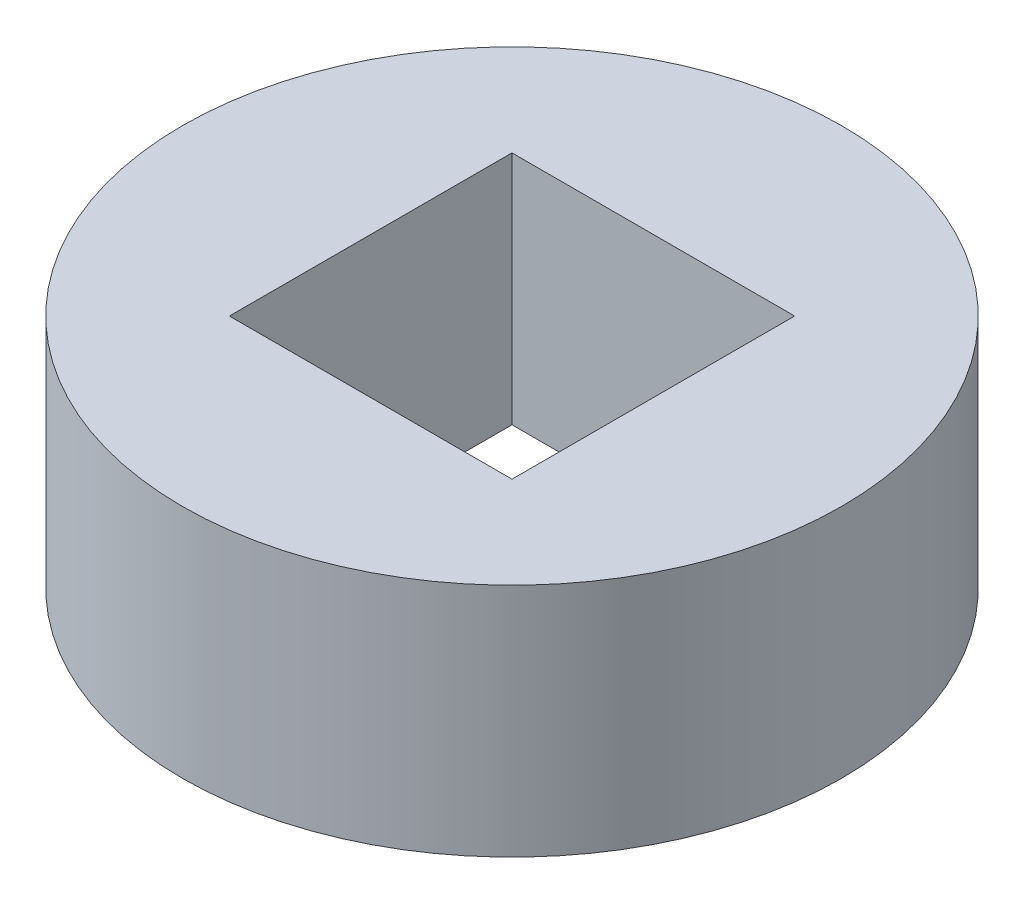
ISO-10303-21;
HEADER;
FILE_DESCRIPTION(('STEP AP214'),'2;1');
FILE_NAME('part.step','',(''),(''),'','','');
FILE_SCHEMA(('AUTOMOTIVE_DESIGN { 1 0 10303 214 1 1 1 1 }'));
ENDSEC;
DATA;
#1=APPLICATION_CONTEXT('core data for automotive mechanical design processes');
#2=APPLICATION_PROTOCOL_DEFINITION('international standard','automotive_design',2000,#1);
#3=PRODUCT_CONTEXT('',#1,'mechanical');
#4=PRODUCT('Part','Part','',(#3));
#5=PRODUCT_RELATED_PRODUCT_CATEGORY('part','',(#4));
#6=PRODUCT_DEFINITION_FORMATION('','',#4);
#7=PRODUCT_DEFINITION_CONTEXT('part definition',#1,'design');
#8=PRODUCT_DEFINITION('design','',#6,#7);
#9=PRODUCT_DEFINITION_SHAPE('','',#8);
#10=(LENGTH_UNIT() NAMED_UNIT(*) SI_UNIT(.MILLI.,.METRE.));
#11=(NAMED_UNIT(*) PLANE_ANGLE_UNIT() SI_UNIT($,.RADIAN.));
#12=(NAMED_UNIT(*) SI_UNIT($,.STERADIAN.) SOLID_ANGLE_UNIT());
#13=UNCERTAINTY_MEASURE_WITH_UNIT(LENGTH_MEASURE(1.E-05),#10,'distance_accuracy_value','');
#14=(GEOMETRIC_REPRESENTATION_CONTEXT(3) GLOBAL_UNCERTAINTY_ASSIGNED_CONTEXT((#13)) GLOBAL_UNIT_ASSIGNED_CONTEXT((#10,
#11,#12)) REPRESENTATION_CONTEXT('',''));
#15=CARTESIAN_POINT('',(0.,0.,0.));
#16=DIRECTION('',(0.,0.,1.));
#17=DIRECTION('',(1.,0.,0.));
#18=AXIS2_PLACEMENT_3D('',#15,#16,#17);
#19=CARTESIAN_POINT('',(0.,5.,0.));
#20=DIRECTION('',(0.,1.,0.));
#21=DIRECTION('',(0.,0.,1.));
#22=AXIS2_PLACEMENT_3D('',#19,#20,#21);
#23=PLANE('',#22);
#24=CARTESIAN_POINT('',(0.,5.,0.));
#25=DIRECTION('',(0.,1.,0.));
#26=DIRECTION('',(0.,0.,1.));
#27=AXIS2_PLACEMENT_3D('',#24,#25,#26);
#28=CIRCLE('',#27,7.);
#29=CARTESIAN_POINT('',(0.,5.,7.));
#30=VERTEX_POINT('',#29);
#31=EDGE_CURVE('E11',#30,#30,#28,.T.);
#32=ORIENTED_EDGE('',*,*,#31,.T.);
#33=EDGE_LOOP('',(#32));
#34=FACE_BOUND('',#33,.T.);
#35=DIRECTION('',(-1.,0.,0.));
#36=VECTOR('',#35,1.);
#37=CARTESIAN_POINT('',(-3.,5.,-3.));
#38=LINE('',#37,#36);
#39=CARTESIAN_POINT('',(3.,5.,-3.));
#40=VERTEX_POINT('',#39);
#41=CARTESIAN_POINT('',(-3.,5.,-3.));
#42=VERTEX_POINT('',#41);
#43=EDGE_CURVE('E82',#40,#42,#38,.T.);
#44=ORIENTED_EDGE('',*,*,#43,.F.);
#45=DIRECTION('',(0.,0.,-1.));
#46=VECTOR('',#45,1.);
#47=CARTESIAN_POINT('',(3.,5.,3.));
#48=LINE('',#47,#46);
#49=CARTESIAN_POINT('',(3.,5.,3.));
#50=VERTEX_POINT('',#49);
#51=EDGE_CURVE('E74',#50,#40,#48,.T.);
#52=ORIENTED_EDGE('',*,*,#51,.F.);
#53=DIRECTION('',(1.,0.,0.));
#54=VECTOR('',#53,1.);
#55=CARTESIAN_POINT('',(-3.,5.,3.));
#56=LINE('',#55,#54);
#57=CARTESIAN_POINT('',(-3.,5.,3.));
#58=VERTEX_POINT('',#57);
#59=EDGE_CURVE('E95',#58,#50,#56,.T.);
#60=ORIENTED_EDGE('',*,*,#59,.F.);
#61=DIRECTION('',(0.,0.,1.));
#62=VECTOR('',#61,1.);
#63=CARTESIAN_POINT('',(-3.,5.,3.));
#64=LINE('',#63,#62);
#65=EDGE_CURVE('E93',#42,#58,#64,.T.);
#66=ORIENTED_EDGE('',*,*,#65,.F.);
#67=EDGE_LOOP('',(#44,#52,#60,#66));
#68=FACE_BOUND('',#67,.T.);
#69=ADVANCED_FACE('F33',(#34,#68),#23,.T.);
#70=CARTESIAN_POINT('',(0.,0.,0.));
#71=DIRECTION('',(0.,1.,0.));
#72=DIRECTION('',(0.,0.,1.));
#73=AXIS2_PLACEMENT_3D('',#70,#71,#72);
#74=PLANE('',#73);
#75=CARTESIAN_POINT('',(0.,0.,0.));
#76=DIRECTION('',(0.,1.,0.));
#77=DIRECTION('',(0.,0.,1.));
#78=AXIS2_PLACEMENT_3D('',#75,#76,#77);
#79=CIRCLE('',#78,7.);
#80=CARTESIAN_POINT('',(0.,0.,7.));
#81=VERTEX_POINT('',#80);
#82=EDGE_CURVE('E37',#81,#81,#79,.T.);
#83=ORIENTED_EDGE('',*,*,#82,.F.);
#84=EDGE_LOOP('',(#83));
#85=FACE_BOUND('',#84,.T.);
#86=DIRECTION('',(0.,0.,-1.));
#87=VECTOR('',#86,1.);
#88=CARTESIAN_POINT('',(3.,0.,3.));
#89=LINE('',#88,#87);
#90=CARTESIAN_POINT('',(3.,0.,3.));
#91=VERTEX_POINT('',#90);
#92=CARTESIAN_POINT('',(3.,0.,-3.));
#93=VERTEX_POINT('',#92);
#94=EDGE_CURVE('E56',#91,#93,#89,.T.);
#95=ORIENTED_EDGE('',*,*,#94,.T.);
#96=DIRECTION('',(-1.,0.,0.));
#97=VECTOR('',#96,1.);
#98=CARTESIAN_POINT('',(-3.,0.,-3.));
#99=LINE('',#98,#97);
#100=CARTESIAN_POINT('',(-3.,0.,-3.));
#101=VERTEX_POINT('',#100);
#102=EDGE_CURVE('E89',#93,#101,#99,.T.);
#103=ORIENTED_EDGE('',*,*,#102,.T.);
#104=DIRECTION('',(0.,0.,1.));
#105=VECTOR('',#104,1.);
#106=CARTESIAN_POINT('',(-3.,0.,3.));
#107=LINE('',#106,#105);
#108=CARTESIAN_POINT('',(-3.,0.,3.));
#109=VERTEX_POINT('',#108);
#110=EDGE_CURVE('E101',#101,#109,#107,.T.);
#111=ORIENTED_EDGE('',*,*,#110,.T.);
#112=DIRECTION('',(1.,0.,0.));
#113=VECTOR('',#112,1.);
#114=CARTESIAN_POINT('',(-3.,0.,3.));
#115=LINE('',#114,#113);
#116=EDGE_CURVE('E83',#109,#91,#115,.T.);
#117=ORIENTED_EDGE('',*,*,#116,.T.);
#118=EDGE_LOOP('',(#95,#103,#111,#117));
#119=FACE_BOUND('',#118,.T.);
#120=ADVANCED_FACE('F112',(#85,#119),#74,.F.);
#121=CARTESIAN_POINT('',(0.,5.,0.));
#122=DIRECTION('',(0.,-1.,0.));
#123=DIRECTION('',(0.,0.,-1.));
#124=AXIS2_PLACEMENT_3D('',#121,#122,#123);
#125=CYLINDRICAL_SURFACE('',#124,7.);
#126=ORIENTED_EDGE('',*,*,#31,.F.);
#127=EDGE_LOOP('',(#126));
#128=FACE_BOUND('',#127,.T.);
#129=ORIENTED_EDGE('',*,*,#82,.T.);
#130=EDGE_LOOP('',(#129));
#131=FACE_BOUND('',#130,.T.);
#132=ADVANCED_FACE('F35',(#128,#131),#125,.T.);
#133=CARTESIAN_POINT('',(3.,5.,3.));
#134=DIRECTION('',(-1.,0.,0.));
#135=DIRECTION('',(0.,0.,1.));
#136=AXIS2_PLACEMENT_3D('',#133,#134,#135);
#137=PLANE('',#136);
#138=ORIENTED_EDGE('',*,*,#94,.F.);
#139=DIRECTION('',(0.,-1.,0.));
#140=VECTOR('',#139,1.);
#141=CARTESIAN_POINT('',(3.,5.,3.));
#142=LINE('',#141,#140);
#143=EDGE_CURVE('E78',#50,#91,#142,.T.);
#144=ORIENTED_EDGE('',*,*,#143,.F.);
#145=ORIENTED_EDGE('',*,*,#51,.T.);
#146=DIRECTION('',(0.,-1.,0.));
#147=VECTOR('',#146,1.);
#148=CARTESIAN_POINT('',(3.,5.,-3.));
#149=LINE('',#148,#147);
#150=EDGE_CURVE('E77',#40,#93,#149,.T.);
#151=ORIENTED_EDGE('',*,*,#150,.T.);
#152=EDGE_LOOP('',(#138,#144,#145,#151));
#153=FACE_BOUND('',#152,.T.);
#154=ADVANCED_FACE('F76',(#153),#137,.T.);
#155=CARTESIAN_POINT('',(-3.,5.,-3.));
#156=DIRECTION('',(0.,0.,1.));
#157=DIRECTION('',(1.,0.,0.));
#158=AXIS2_PLACEMENT_3D('',#155,#156,#157);
#159=PLANE('',#158);
#160=ORIENTED_EDGE('',*,*,#102,.F.);
#161=ORIENTED_EDGE('',*,*,#150,.F.);
#162=ORIENTED_EDGE('',*,*,#43,.T.);
#163=DIRECTION('',(0.,-1.,0.));
#164=VECTOR('',#163,1.);
#165=CARTESIAN_POINT('',(-3.,5.,-3.));
#166=LINE('',#165,#164);
#167=EDGE_CURVE('E90',#42,#101,#166,.T.);
#168=ORIENTED_EDGE('',*,*,#167,.T.);
#169=EDGE_LOOP('',(#160,#161,#162,#168));
#170=FACE_BOUND('',#169,.T.);
#171=ADVANCED_FACE('F86',(#170),#159,.T.);
#172=CARTESIAN_POINT('',(-3.,5.,3.));
#173=DIRECTION('',(1.,0.,0.));
#174=DIRECTION('',(0.,0.,-1.));
#175=AXIS2_PLACEMENT_3D('',#172,#173,#174);
#176=PLANE('',#175);
#177=ORIENTED_EDGE('',*,*,#110,.F.);
#178=ORIENTED_EDGE('',*,*,#167,.F.);
#179=ORIENTED_EDGE('',*,*,#65,.T.);
#180=DIRECTION('',(0.,-1.,0.));
#181=VECTOR('',#180,1.);
#182=CARTESIAN_POINT('',(-3.,5.,3.));
#183=LINE('',#182,#181);
#184=EDGE_CURVE('E48',#58,#109,#183,.T.);
#185=ORIENTED_EDGE('',*,*,#184,.T.);
#186=EDGE_LOOP('',(#177,#178,#179,#185));
#187=FACE_BOUND('',#186,.T.);
#188=ADVANCED_FACE('F110',(#187),#176,.T.);
#189=CARTESIAN_POINT('',(-3.,5.,3.));
#190=DIRECTION('',(0.,0.,-1.));
#191=DIRECTION('',(-1.,0.,0.));
#192=AXIS2_PLACEMENT_3D('',#189,#190,#191);
#193=PLANE('',#192);
#194=ORIENTED_EDGE('',*,*,#116,.F.);
#195=ORIENTED_EDGE('',*,*,#184,.F.);
#196=ORIENTED_EDGE('',*,*,#59,.T.);
#197=ORIENTED_EDGE('',*,*,#143,.T.);
#198=EDGE_LOOP('',(#194,#195,#196,#197));
#199=FACE_BOUND('',#198,.T.);
#200=ADVANCED_FACE('F113',(#199),#193,.T.);
#201=CLOSED_SHELL('',(#69,#120,#132,#154,#171,#188,#200));
#202=MANIFOLD_SOLID_BREP('B2',#201);
#203=ADVANCED_BREP_SHAPE_REPRESENTATION('',(#18,#202),#14);
#204=SHAPE_DEFINITION_REPRESENTATION(#9,#203);
ENDSEC;
END-ISO-10303-21;
